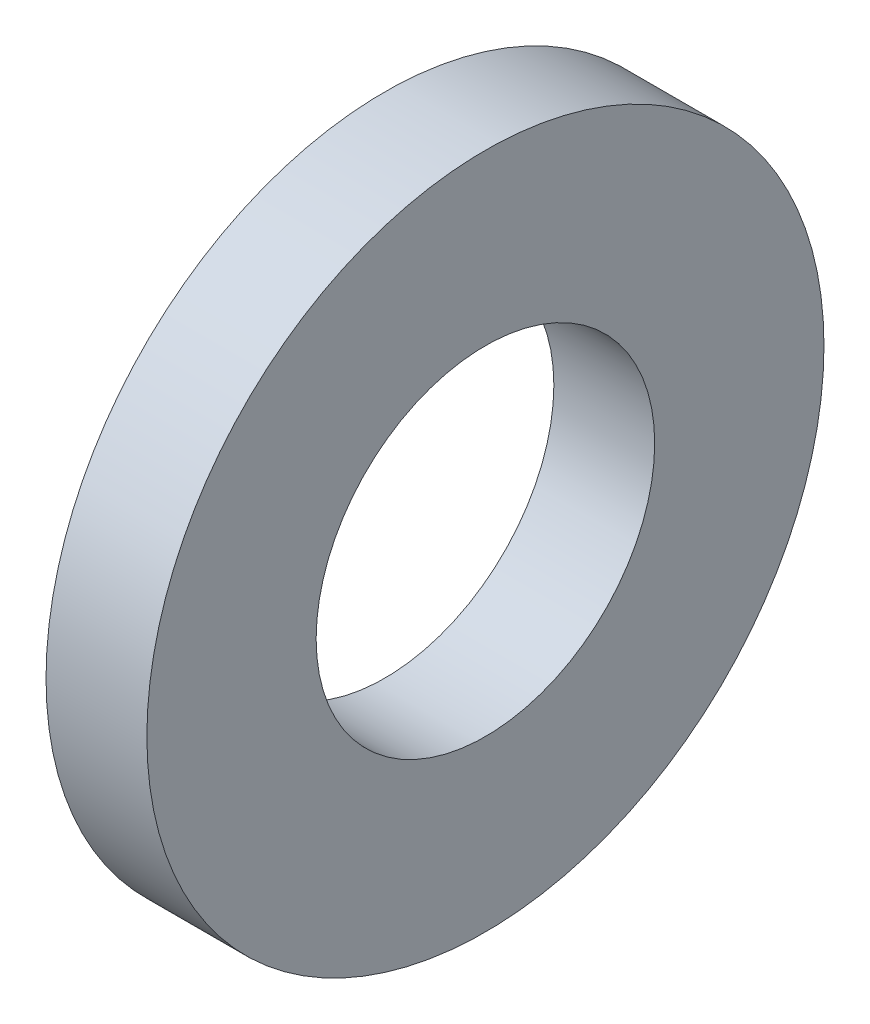
ISO-10303-21;
HEADER;
FILE_DESCRIPTION(('STEP AP214'),'2;1');
FILE_NAME('part.step','',(''),(''),'','','');
FILE_SCHEMA(('AUTOMOTIVE_DESIGN { 1 0 10303 214 1 1 1 1 }'));
ENDSEC;
DATA;
#1=APPLICATION_CONTEXT('core data for automotive mechanical design processes');
#2=APPLICATION_PROTOCOL_DEFINITION('international standard','automotive_design',2000,#1);
#3=PRODUCT_CONTEXT('',#1,'mechanical');
#4=PRODUCT('Part','Part','',(#3));
#5=PRODUCT_RELATED_PRODUCT_CATEGORY('part','',(#4));
#6=PRODUCT_DEFINITION_FORMATION('','',#4);
#7=PRODUCT_DEFINITION_CONTEXT('part definition',#1,'design');
#8=PRODUCT_DEFINITION('design','',#6,#7);
#9=PRODUCT_DEFINITION_SHAPE('','',#8);
#10=(LENGTH_UNIT() NAMED_UNIT(*) SI_UNIT(.MILLI.,.METRE.));
#11=(NAMED_UNIT(*) PLANE_ANGLE_UNIT() SI_UNIT($,.RADIAN.));
#12=(NAMED_UNIT(*) SI_UNIT($,.STERADIAN.) SOLID_ANGLE_UNIT());
#13=UNCERTAINTY_MEASURE_WITH_UNIT(LENGTH_MEASURE(1.E-05),#10,'distance_accuracy_value','');
#14=(GEOMETRIC_REPRESENTATION_CONTEXT(3) GLOBAL_UNCERTAINTY_ASSIGNED_CONTEXT((#13)) GLOBAL_UNIT_ASSIGNED_CONTEXT((#10,
#11,#12)) REPRESENTATION_CONTEXT('',''));
#15=CARTESIAN_POINT('',(0.,0.,0.));
#16=DIRECTION('',(0.,0.,1.));
#17=DIRECTION('',(1.,0.,0.));
#18=AXIS2_PLACEMENT_3D('',#15,#16,#17);
#19=CARTESIAN_POINT('',(0.7112,0.,0.));
#20=DIRECTION('',(1.,0.,0.));
#21=DIRECTION('',(0.,0.,-1.));
#22=AXIS2_PLACEMENT_3D('',#19,#20,#21);
#23=PLANE('',#22);
#24=CARTESIAN_POINT('',(0.7112,0.,0.));
#25=DIRECTION('',(1.,0.,0.));
#26=DIRECTION('',(0.,0.,-1.));
#27=AXIS2_PLACEMENT_3D('',#24,#25,#26);
#28=CIRCLE('',#27,2.3876);
#29=CARTESIAN_POINT('',(0.7112,0.,-2.3876));
#30=VERTEX_POINT('',#29);
#31=EDGE_CURVE('E10',#30,#30,#28,.T.);
#32=ORIENTED_EDGE('',*,*,#31,.T.);
#33=EDGE_LOOP('',(#32));
#34=FACE_BOUND('',#33,.T.);
#35=CARTESIAN_POINT('',(0.7112,0.,0.));
#36=DIRECTION('',(1.,0.,0.));
#37=DIRECTION('',(0.,0.,-1.));
#38=AXIS2_PLACEMENT_3D('',#35,#36,#37);
#39=CIRCLE('',#38,1.1938);
#40=CARTESIAN_POINT('',(0.7112,0.,-1.1938));
#41=VERTEX_POINT('',#40);
#42=EDGE_CURVE('E42',#41,#41,#39,.T.);
#43=ORIENTED_EDGE('',*,*,#42,.F.);
#44=EDGE_LOOP('',(#43));
#45=FACE_BOUND('',#44,.T.);
#46=ADVANCED_FACE('F31',(#34,#45),#23,.T.);
#47=CARTESIAN_POINT('',(0.,0.,0.));
#48=DIRECTION('',(1.,0.,0.));
#49=DIRECTION('',(0.,0.,-1.));
#50=AXIS2_PLACEMENT_3D('',#47,#48,#49);
#51=PLANE('',#50);
#52=CARTESIAN_POINT('',(0.,0.,0.));
#53=DIRECTION('',(1.,0.,0.));
#54=DIRECTION('',(0.,0.,-1.));
#55=AXIS2_PLACEMENT_3D('',#52,#53,#54);
#56=CIRCLE('',#55,2.3876);
#57=CARTESIAN_POINT('',(0.,0.,-2.3876));
#58=VERTEX_POINT('',#57);
#59=EDGE_CURVE('E35',#58,#58,#56,.T.);
#60=ORIENTED_EDGE('',*,*,#59,.F.);
#61=EDGE_LOOP('',(#60));
#62=FACE_BOUND('',#61,.T.);
#63=CARTESIAN_POINT('',(0.,0.,0.));
#64=DIRECTION('',(1.,0.,0.));
#65=DIRECTION('',(0.,0.,-1.));
#66=AXIS2_PLACEMENT_3D('',#63,#64,#65);
#67=CIRCLE('',#66,1.1938);
#68=CARTESIAN_POINT('',(0.,0.,-1.1938));
#69=VERTEX_POINT('',#68);
#70=EDGE_CURVE('E44',#69,#69,#67,.T.);
#71=ORIENTED_EDGE('',*,*,#70,.T.);
#72=EDGE_LOOP('',(#71));
#73=FACE_BOUND('',#72,.T.);
#74=ADVANCED_FACE('F54',(#62,#73),#51,.F.);
#75=CARTESIAN_POINT('',(0.7112,0.,0.));
#76=DIRECTION('',(-1.,0.,0.));
#77=DIRECTION('',(0.,0.,1.));
#78=AXIS2_PLACEMENT_3D('',#75,#76,#77);
#79=CYLINDRICAL_SURFACE('',#78,2.3876);
#80=ORIENTED_EDGE('',*,*,#31,.F.);
#81=EDGE_LOOP('',(#80));
#82=FACE_BOUND('',#81,.T.);
#83=ORIENTED_EDGE('',*,*,#59,.T.);
#84=EDGE_LOOP('',(#83));
#85=FACE_BOUND('',#84,.T.);
#86=ADVANCED_FACE('F33',(#82,#85),#79,.T.);
#87=CARTESIAN_POINT('',(0.7112,0.,0.));
#88=DIRECTION('',(-1.,0.,0.));
#89=DIRECTION('',(0.,0.,1.));
#90=AXIS2_PLACEMENT_3D('',#87,#88,#89);
#91=CYLINDRICAL_SURFACE('',#90,1.1938);
#92=ORIENTED_EDGE('',*,*,#42,.T.);
#93=EDGE_LOOP('',(#92));
#94=FACE_BOUND('',#93,.T.);
#95=ORIENTED_EDGE('',*,*,#70,.F.);
#96=EDGE_LOOP('',(#95));
#97=FACE_BOUND('',#96,.T.);
#98=ADVANCED_FACE('F50',(#94,#97),#91,.F.);
#99=CLOSED_SHELL('',(#46,#74,#86,#98));
#100=MANIFOLD_SOLID_BREP('B2',#99);
#101=ADVANCED_BREP_SHAPE_REPRESENTATION('',(#18,#100),#14);
#102=SHAPE_DEFINITION_REPRESENTATION(#9,#101);
ENDSEC;
END-ISO-10303-21;
